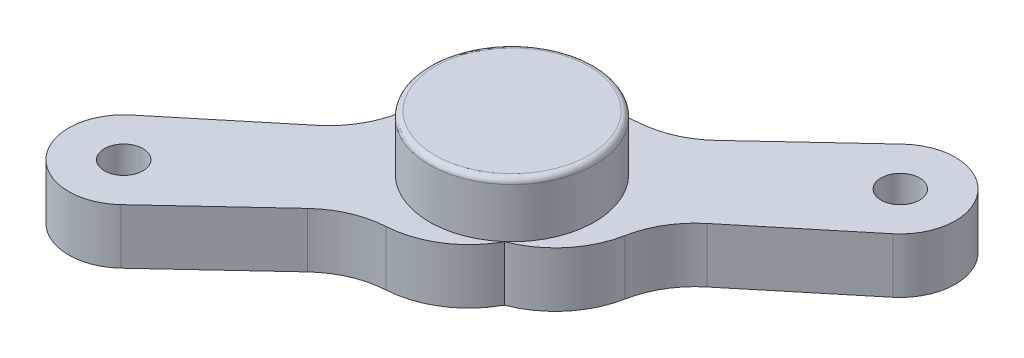
ISO-10303-21;
HEADER;
FILE_DESCRIPTION(('STEP AP214'),'2;1');
FILE_NAME('part.step','',(''),(''),'','','');
FILE_SCHEMA(('AUTOMOTIVE_DESIGN { 1 0 10303 214 1 1 1 1 }'));
ENDSEC;
DATA;
#1=APPLICATION_CONTEXT('core data for automotive mechanical design processes');
#2=APPLICATION_PROTOCOL_DEFINITION('international standard','automotive_design',2000,#1);
#3=PRODUCT_CONTEXT('',#1,'mechanical');
#4=PRODUCT('Part','Part','',(#3));
#5=PRODUCT_RELATED_PRODUCT_CATEGORY('part','',(#4));
#6=PRODUCT_DEFINITION_FORMATION('','',#4);
#7=PRODUCT_DEFINITION_CONTEXT('part definition',#1,'design');
#8=PRODUCT_DEFINITION('design','',#6,#7);
#9=PRODUCT_DEFINITION_SHAPE('','',#8);
#10=(LENGTH_UNIT() NAMED_UNIT(*) SI_UNIT(.MILLI.,.METRE.));
#11=(NAMED_UNIT(*) PLANE_ANGLE_UNIT() SI_UNIT($,.RADIAN.));
#12=(NAMED_UNIT(*) SI_UNIT($,.STERADIAN.) SOLID_ANGLE_UNIT());
#13=UNCERTAINTY_MEASURE_WITH_UNIT(LENGTH_MEASURE(1.E-05),#10,'distance_accuracy_value','');
#14=(GEOMETRIC_REPRESENTATION_CONTEXT(3) GLOBAL_UNCERTAINTY_ASSIGNED_CONTEXT((#13)) GLOBAL_UNIT_ASSIGNED_CONTEXT((#10,
#11,#12)) REPRESENTATION_CONTEXT('',''));
#15=CARTESIAN_POINT('',(0.,0.,0.));
#16=DIRECTION('',(0.,0.,1.));
#17=DIRECTION('',(1.,0.,0.));
#18=AXIS2_PLACEMENT_3D('',#15,#16,#17);
#19=CARTESIAN_POINT('',(0.,5.,0.));
#20=DIRECTION('',(0.,-1.,0.));
#21=DIRECTION('',(0.,0.,-1.));
#22=AXIS2_PLACEMENT_3D('',#19,#20,#21);
#23=CYLINDRICAL_SURFACE('',#22,7.5);
#24=CARTESIAN_POINT('',(0.,4.5,0.));
#25=DIRECTION('',(0.,1.,0.));
#26=DIRECTION('',(0.,0.,1.));
#27=AXIS2_PLACEMENT_3D('',#24,#25,#26);
#28=CIRCLE('',#27,7.5);
#29=CARTESIAN_POINT('',(0.,4.5,7.5));
#30=VERTEX_POINT('',#29);
#31=EDGE_CURVE('E11',#30,#30,#28,.F.);
#32=ORIENTED_EDGE('',*,*,#31,.T.);
#33=EDGE_LOOP('',(#32));
#34=FACE_BOUND('',#33,.T.);
#35=CARTESIAN_POINT('',(0.,0.,0.));
#36=DIRECTION('',(0.,1.,0.));
#37=DIRECTION('',(0.,0.,1.));
#38=AXIS2_PLACEMENT_3D('',#35,#36,#37);
#39=CIRCLE('',#38,7.5);
#40=CARTESIAN_POINT('',(4.94627298267681,0.,5.63776405863543));
#41=VERTEX_POINT('',#40);
#42=CARTESIAN_POINT('',(-4.94627298267681,0.,-5.63776405863543));
#43=VERTEX_POINT('',#42);
#44=EDGE_CURVE('E174',#41,#43,#39,.T.);
#45=ORIENTED_EDGE('',*,*,#44,.T.);
#46=EDGE_CURVE('E164',#43,#41,#39,.T.);
#47=ORIENTED_EDGE('',*,*,#46,.T.);
#48=EDGE_LOOP('',(#45,#47));
#49=FACE_BOUND('',#48,.T.);
#50=ADVANCED_FACE('F39',(#34,#49),#23,.T.);
#51=CARTESIAN_POINT('',(0.,5.,0.));
#52=DIRECTION('',(0.,1.,0.));
#53=DIRECTION('',(0.,0.,1.));
#54=AXIS2_PLACEMENT_3D('',#51,#52,#53);
#55=PLANE('',#54);
#56=CARTESIAN_POINT('',(0.,5.,0.));
#57=DIRECTION('',(0.,1.,0.));
#58=DIRECTION('',(0.,0.,1.));
#59=AXIS2_PLACEMENT_3D('',#56,#57,#58);
#60=CIRCLE('',#59,7.);
#61=CARTESIAN_POINT('',(0.,5.,7.));
#62=VERTEX_POINT('',#61);
#63=EDGE_CURVE('E47',#62,#62,#60,.T.);
#64=ORIENTED_EDGE('',*,*,#63,.T.);
#65=EDGE_LOOP('',(#64));
#66=FACE_BOUND('',#65,.T.);
#67=ADVANCED_FACE('F179',(#66),#55,.T.);
#68=CARTESIAN_POINT('',(2.09264945411429,-5.,-1.8359788294518));
#69=DIRECTION('',(0.,1.,0.));
#70=DIRECTION('',(0.,0.,1.));
#71=AXIS2_PLACEMENT_3D('',#68,#69,#70);
#72=CYLINDRICAL_SURFACE('',#71,8.);
#73=CARTESIAN_POINT('',(2.09264945411429,0.,-1.8359788294518));
#74=DIRECTION('',(0.,1.,0.));
#75=DIRECTION('',(0.,0.,1.));
#76=AXIS2_PLACEMENT_3D('',#73,#74,#75);
#77=CIRCLE('',#76,8.);
#78=CARTESIAN_POINT('',(1.62137411316843,0.,-9.82208548745583));
#79=VERTEX_POINT('',#78);
#80=EDGE_CURVE('E160',#79,#43,#77,.T.);
#81=ORIENTED_EDGE('',*,*,#80,.F.);
#82=DIRECTION('',(0.,1.,0.));
#83=VECTOR('',#82,1.);
#84=CARTESIAN_POINT('',(1.62137411316843,-5.,-9.82208548745583));
#85=LINE('',#84,#83);
#86=CARTESIAN_POINT('',(1.62137411316843,-5.,-9.82208548745583));
#87=VERTEX_POINT('',#86);
#88=EDGE_CURVE('E124',#87,#79,#85,.T.);
#89=ORIENTED_EDGE('',*,*,#88,.F.);
#90=CARTESIAN_POINT('',(2.09264945411429,-5.,-1.8359788294518));
#91=DIRECTION('',(0.,1.,0.));
#92=DIRECTION('',(0.,0.,1.));
#93=AXIS2_PLACEMENT_3D('',#90,#91,#92);
#94=CIRCLE('',#93,8.);
#95=CARTESIAN_POINT('',(-4.94627298267681,-5.,-5.63776405863543));
#96=VERTEX_POINT('',#95);
#97=EDGE_CURVE('E63',#87,#96,#94,.T.);
#98=ORIENTED_EDGE('',*,*,#97,.T.);
#99=DIRECTION('',(0.,1.,0.));
#100=VECTOR('',#99,1.);
#101=CARTESIAN_POINT('',(-4.94627298267681,-5.,-5.63776405863543));
#102=LINE('',#101,#100);
#103=EDGE_CURVE('E89',#96,#43,#102,.T.);
#104=ORIENTED_EDGE('',*,*,#103,.T.);
#105=EDGE_LOOP('',(#81,#89,#98,#104));
#106=FACE_BOUND('',#105,.T.);
#107=ADVANCED_FACE('F196',(#106),#72,.T.);
#108=CARTESIAN_POINT('',(1.15009877222259,-5.,-17.8081921454599));
#109=DIRECTION('',(0.,1.,0.));
#110=DIRECTION('',(0.,0.,1.));
#111=AXIS2_PLACEMENT_3D('',#108,#109,#110);
#112=CYLINDRICAL_SURFACE('',#111,8.00000000000002);
#113=CARTESIAN_POINT('',(1.15009877222259,0.,-17.8081921454599));
#114=DIRECTION('',(0.,-1.,0.));
#115=DIRECTION('',(0.,0.,1.));
#116=AXIS2_PLACEMENT_3D('',#113,#114,#115);
#117=CIRCLE('',#116,8.00000000000002);
#118=CARTESIAN_POINT('',(6.60708123178031,0.,-11.9582910833837));
#119=VERTEX_POINT('',#118);
#120=EDGE_CURVE('E119',#119,#79,#117,.T.);
#121=ORIENTED_EDGE('',*,*,#120,.F.);
#122=DIRECTION('',(0.,1.,0.));
#123=VECTOR('',#122,1.);
#124=CARTESIAN_POINT('',(6.60708123178031,-5.,-11.9582910833837));
#125=LINE('',#124,#123);
#126=CARTESIAN_POINT('',(6.60708123178031,-5.,-11.9582910833837));
#127=VERTEX_POINT('',#126);
#128=EDGE_CURVE('E114',#127,#119,#125,.T.);
#129=ORIENTED_EDGE('',*,*,#128,.F.);
#130=CARTESIAN_POINT('',(1.15009877222259,-5.,-17.8081921454599));
#131=DIRECTION('',(0.,-1.,0.));
#132=DIRECTION('',(0.,0.,1.));
#133=AXIS2_PLACEMENT_3D('',#130,#131,#132);
#134=CIRCLE('',#133,8.00000000000002);
#135=EDGE_CURVE('E117',#127,#87,#134,.T.);
#136=ORIENTED_EDGE('',*,*,#135,.T.);
#137=ORIENTED_EDGE('',*,*,#88,.T.);
#138=EDGE_LOOP('',(#121,#129,#136,#137));
#139=FACE_BOUND('',#138,.T.);
#140=ADVANCED_FACE('F116',(#139),#112,.F.);
#141=CARTESIAN_POINT('',(6.60708123178031,-5.,-11.9582910833837));
#142=DIRECTION('',(-0.682122807444714,0.,-0.731237632759517));
#143=DIRECTION('',(-0.731237632759517,0.,0.682122807444714));
#144=AXIS2_PLACEMENT_3D('',#141,#142,#143);
#145=PLANE('',#144);
#146=DIRECTION('',(-0.731237632759517,0.,0.682122807444714));
#147=VECTOR('',#146,1.);
#148=CARTESIAN_POINT('',(6.60708123178031,0.,-11.9582910833837));
#149=LINE('',#148,#147);
#150=CARTESIAN_POINT('',(15.3819328248945,0.,-20.1437647727203));
#151=VERTEX_POINT('',#150);
#152=EDGE_CURVE('E157',#151,#119,#149,.T.);
#153=ORIENTED_EDGE('',*,*,#152,.F.);
#154=DIRECTION('',(0.,1.,0.));
#155=VECTOR('',#154,1.);
#156=CARTESIAN_POINT('',(15.3819328248945,-5.,-20.1437647727203));
#157=LINE('',#156,#155);
#158=CARTESIAN_POINT('',(15.3819328248945,-5.,-20.1437647727203));
#159=VERTEX_POINT('',#158);
#160=EDGE_CURVE('E125',#159,#151,#157,.T.);
#161=ORIENTED_EDGE('',*,*,#160,.F.);
#162=DIRECTION('',(-0.731237632759517,0.,0.682122807444714));
#163=VECTOR('',#162,1.);
#164=CARTESIAN_POINT('',(6.60708123178031,-5.,-11.9582910833837));
#165=LINE('',#164,#163);
#166=EDGE_CURVE('E133',#159,#127,#165,.T.);
#167=ORIENTED_EDGE('',*,*,#166,.T.);
#168=ORIENTED_EDGE('',*,*,#128,.T.);
#169=EDGE_LOOP('',(#153,#161,#167,#168));
#170=FACE_BOUND('',#169,.T.);
#171=ADVANCED_FACE('F137',(#170),#145,.T.);
#172=CARTESIAN_POINT('',(18.7925468621181,-5.,-16.4875766089227));
#173=DIRECTION('',(0.,1.,0.));
#174=DIRECTION('',(0.,0.,1.));
#175=AXIS2_PLACEMENT_3D('',#172,#173,#174);
#176=CYLINDRICAL_SURFACE('',#175,5.);
#177=CARTESIAN_POINT('',(18.7925468621181,0.,-16.4875766089227));
#178=DIRECTION('',(0.,1.,0.));
#179=DIRECTION('',(0.,0.,-1.));
#180=AXIS2_PLACEMENT_3D('',#177,#178,#179);
#181=CIRCLE('',#180,5.);
#182=CARTESIAN_POINT('',(21.9738953350123,0.,-12.6302430876915));
#183=VERTEX_POINT('',#182);
#184=EDGE_CURVE('E154',#183,#151,#181,.T.);
#185=ORIENTED_EDGE('',*,*,#184,.F.);
#186=DIRECTION('',(0.,1.,0.));
#187=VECTOR('',#186,1.);
#188=CARTESIAN_POINT('',(21.9738953350123,-5.,-12.6302430876915));
#189=LINE('',#188,#187);
#190=CARTESIAN_POINT('',(21.9738953350123,-5.,-12.6302430876915));
#191=VERTEX_POINT('',#190);
#192=EDGE_CURVE('E167',#191,#183,#189,.T.);
#193=ORIENTED_EDGE('',*,*,#192,.F.);
#194=CARTESIAN_POINT('',(18.7925468621181,-5.,-16.4875766089227));
#195=DIRECTION('',(0.,1.,0.));
#196=DIRECTION('',(0.,0.,-1.));
#197=AXIS2_PLACEMENT_3D('',#194,#195,#196);
#198=CIRCLE('',#197,5.);
#199=EDGE_CURVE('E138',#191,#159,#198,.T.);
#200=ORIENTED_EDGE('',*,*,#199,.T.);
#201=ORIENTED_EDGE('',*,*,#160,.T.);
#202=EDGE_LOOP('',(#185,#193,#200,#201));
#203=FACE_BOUND('',#202,.T.);
#204=ADVANCED_FACE('F209',(#203),#176,.T.);
#205=CARTESIAN_POINT('',(12.7162948840575,-5.,-4.99500675274544));
#206=DIRECTION('',(0.636269694578841,0.,0.771466704246236));
#207=DIRECTION('',(0.771466704246236,0.,-0.636269694578841));
#208=AXIS2_PLACEMENT_3D('',#205,#206,#207);
#209=PLANE('',#208);
#210=DIRECTION('',(0.771466704246236,0.,-0.636269694578841));
#211=VECTOR('',#210,1.);
#212=CARTESIAN_POINT('',(12.7162948840575,0.,-4.99500675274544));
#213=LINE('',#212,#211);
#214=CARTESIAN_POINT('',(12.7162948840575,0.,-4.99500675274544));
#215=VERTEX_POINT('',#214);
#216=EDGE_CURVE('E151',#215,#183,#213,.T.);
#217=ORIENTED_EDGE('',*,*,#216,.F.);
#218=DIRECTION('',(0.,1.,0.));
#219=VECTOR('',#218,1.);
#220=CARTESIAN_POINT('',(12.7162948840575,-5.,-4.99500675274544));
#221=LINE('',#220,#219);
#222=CARTESIAN_POINT('',(12.7162948840575,-5.,-4.99500675274544));
#223=VERTEX_POINT('',#222);
#224=EDGE_CURVE('E169',#223,#215,#221,.T.);
#225=ORIENTED_EDGE('',*,*,#224,.F.);
#226=DIRECTION('',(0.771466704246236,0.,-0.636269694578841));
#227=VECTOR('',#226,1.);
#228=CARTESIAN_POINT('',(12.7162948840575,-5.,-4.99500675274544));
#229=LINE('',#228,#227);
#230=EDGE_CURVE('E140',#223,#191,#229,.T.);
#231=ORIENTED_EDGE('',*,*,#230,.T.);
#232=ORIENTED_EDGE('',*,*,#192,.T.);
#233=EDGE_LOOP('',(#217,#225,#231,#232));
#234=FACE_BOUND('',#233,.T.);
#235=ADVANCED_FACE('F206',(#234),#209,.T.);
#236=CARTESIAN_POINT('',(17.8064524406882,-5.,1.17672688122446));
#237=DIRECTION('',(0.,1.,0.));
#238=DIRECTION('',(0.,0.,1.));
#239=AXIS2_PLACEMENT_3D('',#236,#237,#238);
#240=CYLINDRICAL_SURFACE('',#239,8.00000000000003);
#241=CARTESIAN_POINT('',(17.8064524406882,0.,1.17672688122446));
#242=DIRECTION('',(0.,-1.,0.));
#243=DIRECTION('',(0.,0.,-1.));
#244=AXIS2_PLACEMENT_3D('',#241,#242,#243);
#245=CIRCLE('',#244,8.00000000000003);
#246=CARTESIAN_POINT('',(9.94955094740123,0.,-0.329625974113668));
#247=VERTEX_POINT('',#246);
#248=EDGE_CURVE('E147',#247,#215,#245,.T.);
#249=ORIENTED_EDGE('',*,*,#248,.F.);
#250=DIRECTION('',(0.,1.,0.));
#251=VECTOR('',#250,1.);
#252=CARTESIAN_POINT('',(9.94955094740123,-5.,-0.329625974113668));
#253=LINE('',#252,#251);
#254=CARTESIAN_POINT('',(9.94955094740123,-5.,-0.329625974113668));
#255=VERTEX_POINT('',#254);
#256=EDGE_CURVE('E97',#255,#247,#253,.T.);
#257=ORIENTED_EDGE('',*,*,#256,.F.);
#258=CARTESIAN_POINT('',(17.8064524406882,-5.,1.17672688122446));
#259=DIRECTION('',(0.,-1.,0.));
#260=DIRECTION('',(0.,0.,-1.));
#261=AXIS2_PLACEMENT_3D('',#258,#259,#260);
#262=CIRCLE('',#261,8.00000000000003);
#263=EDGE_CURVE('E329',#255,#223,#262,.T.);
#264=ORIENTED_EDGE('',*,*,#263,.T.);
#265=ORIENTED_EDGE('',*,*,#224,.T.);
#266=EDGE_LOOP('',(#249,#257,#264,#265));
#267=FACE_BOUND('',#266,.T.);
#268=ADVANCED_FACE('F203',(#267),#240,.F.);
#269=CARTESIAN_POINT('',(2.09264945411429,-5.,-1.8359788294518));
#270=DIRECTION('',(0.,1.,0.));
#271=DIRECTION('',(0.,0.,1.));
#272=AXIS2_PLACEMENT_3D('',#269,#270,#271);
#273=CYLINDRICAL_SURFACE('',#272,8.);
#274=CARTESIAN_POINT('',(2.09264945411429,0.,-1.8359788294518));
#275=DIRECTION('',(0.,1.,0.));
#276=DIRECTION('',(0.,0.,-1.));
#277=AXIS2_PLACEMENT_3D('',#274,#275,#276);
#278=CIRCLE('',#277,8.);
#279=EDGE_CURVE('E54',#41,#247,#278,.T.);
#280=ORIENTED_EDGE('',*,*,#279,.F.);
#281=DIRECTION('',(0.,1.,0.));
#282=VECTOR('',#281,1.);
#283=CARTESIAN_POINT('',(4.94627298267682,-5.,5.63776405863543));
#284=LINE('',#283,#282);
#285=CARTESIAN_POINT('',(4.94627298267681,-5.,5.63776405863543));
#286=VERTEX_POINT('',#285);
#287=EDGE_CURVE('E145',#286,#41,#284,.T.);
#288=ORIENTED_EDGE('',*,*,#287,.F.);
#289=CARTESIAN_POINT('',(2.09264945411429,-5.,-1.8359788294518));
#290=DIRECTION('',(0.,1.,0.));
#291=DIRECTION('',(0.,0.,-1.));
#292=AXIS2_PLACEMENT_3D('',#289,#290,#291);
#293=CIRCLE('',#292,8.);
#294=EDGE_CURVE('E162',#286,#255,#293,.T.);
#295=ORIENTED_EDGE('',*,*,#294,.T.);
#296=ORIENTED_EDGE('',*,*,#256,.T.);
#297=EDGE_LOOP('',(#280,#288,#295,#296));
#298=FACE_BOUND('',#297,.T.);
#299=ADVANCED_FACE('F200',(#298),#273,.T.);
#300=CARTESIAN_POINT('',(2.09264945411429,-5.,-1.8359788294518));
#301=DIRECTION('',(0.,1.,0.));
#302=DIRECTION('',(0.,0.,1.));
#303=AXIS2_PLACEMENT_3D('',#300,#301,#302);
#304=PLANE('',#303);
#305=CARTESIAN_POINT('',(18.7925468621181,-5.,-16.4875766089227));
#306=DIRECTION('',(0.,1.,0.));
#307=DIRECTION('',(0.,0.,1.));
#308=AXIS2_PLACEMENT_3D('',#305,#306,#307);
#309=CIRCLE('',#308,1.75000000000005);
#310=CARTESIAN_POINT('',(18.7925468621181,-5.,-14.7375766089227));
#311=VERTEX_POINT('',#310);
#312=EDGE_CURVE('E148',#311,#311,#309,.T.);
#313=ORIENTED_EDGE('',*,*,#312,.T.);
#314=EDGE_LOOP('',(#313));
#315=FACE_BOUND('',#314,.T.);
#316=ORIENTED_EDGE('',*,*,#294,.F.);
#317=CARTESIAN_POINT('',(-2.09264945411429,-5.,1.8359788294518));
#318=DIRECTION('',(0.,1.,0.));
#319=DIRECTION('',(0.,0.,-1.));
#320=AXIS2_PLACEMENT_3D('',#317,#318,#319);
#321=CIRCLE('',#320,8.);
#322=CARTESIAN_POINT('',(-1.62137411316843,-5.,9.82208548745583));
#323=VERTEX_POINT('',#322);
#324=EDGE_CURVE('E291',#323,#286,#321,.T.);
#325=ORIENTED_EDGE('',*,*,#324,.F.);
#326=CARTESIAN_POINT('',(-1.15009877222259,-5.,17.8081921454599));
#327=DIRECTION('',(0.,-1.,0.));
#328=DIRECTION('',(0.,0.,-1.));
#329=AXIS2_PLACEMENT_3D('',#326,#327,#328);
#330=CIRCLE('',#329,8.00000000000002);
#331=CARTESIAN_POINT('',(-6.60708123178031,-5.,11.9582910833837));
#332=VERTEX_POINT('',#331);
#333=EDGE_CURVE('E344',#332,#323,#330,.T.);
#334=ORIENTED_EDGE('',*,*,#333,.F.);
#335=DIRECTION('',(0.731237632759517,0.,-0.682122807444714));
#336=VECTOR('',#335,1.);
#337=CARTESIAN_POINT('',(-6.60708123178031,-5.,11.9582910833837));
#338=LINE('',#337,#336);
#339=CARTESIAN_POINT('',(-15.3819328248945,-5.,20.1437647727203));
#340=VERTEX_POINT('',#339);
#341=EDGE_CURVE('E345',#340,#332,#338,.T.);
#342=ORIENTED_EDGE('',*,*,#341,.F.);
#343=CARTESIAN_POINT('',(-18.7925468621181,-5.,16.4875766089227));
#344=DIRECTION('',(0.,1.,0.));
#345=DIRECTION('',(0.,0.,1.));
#346=AXIS2_PLACEMENT_3D('',#343,#344,#345);
#347=CIRCLE('',#346,5.);
#348=CARTESIAN_POINT('',(-21.9738953350123,-5.,12.6302430876915));
#349=VERTEX_POINT('',#348);
#350=EDGE_CURVE('E348',#349,#340,#347,.T.);
#351=ORIENTED_EDGE('',*,*,#350,.F.);
#352=DIRECTION('',(-0.771466704246236,0.,0.636269694578841));
#353=VECTOR('',#352,1.);
#354=CARTESIAN_POINT('',(-12.7162948840575,-5.,4.99500675274544));
#355=LINE('',#354,#353);
#356=CARTESIAN_POINT('',(-12.7162948840575,-5.,4.99500675274544));
#357=VERTEX_POINT('',#356);
#358=EDGE_CURVE('E353',#357,#349,#355,.T.);
#359=ORIENTED_EDGE('',*,*,#358,.F.);
#360=CARTESIAN_POINT('',(-17.8064524406882,-5.,-1.17672688122446));
#361=DIRECTION('',(0.,-1.,0.));
#362=DIRECTION('',(0.,0.,1.));
#363=AXIS2_PLACEMENT_3D('',#360,#361,#362);
#364=CIRCLE('',#363,8.00000000000003);
#365=CARTESIAN_POINT('',(-9.94955094740123,-5.,0.329625974113668));
#366=VERTEX_POINT('',#365);
#367=EDGE_CURVE('E356',#366,#357,#364,.T.);
#368=ORIENTED_EDGE('',*,*,#367,.F.);
#369=CARTESIAN_POINT('',(-2.09264945411429,-5.,1.8359788294518));
#370=DIRECTION('',(0.,1.,0.));
#371=DIRECTION('',(0.,0.,1.));
#372=AXIS2_PLACEMENT_3D('',#369,#370,#371);
#373=CIRCLE('',#372,8.);
#374=EDGE_CURVE('E305',#96,#366,#373,.T.);
#375=ORIENTED_EDGE('',*,*,#374,.F.);
#376=ORIENTED_EDGE('',*,*,#97,.F.);
#377=ORIENTED_EDGE('',*,*,#135,.F.);
#378=ORIENTED_EDGE('',*,*,#166,.F.);
#379=ORIENTED_EDGE('',*,*,#199,.F.);
#380=ORIENTED_EDGE('',*,*,#230,.F.);
#381=ORIENTED_EDGE('',*,*,#263,.F.);
#382=EDGE_LOOP('',(#316,#325,#334,#342,#351,#359,#368,#375,#376,#377,#378,#379,#380,#381));
#383=FACE_BOUND('',#382,.T.);
#384=CARTESIAN_POINT('',(-18.7925468621181,-5.,16.4875766089227));
#385=DIRECTION('',(0.,1.,0.));
#386=DIRECTION('',(0.,0.,-1.));
#387=AXIS2_PLACEMENT_3D('',#384,#385,#386);
#388=CIRCLE('',#387,1.75000000000005);
#389=CARTESIAN_POINT('',(-18.7925468621181,-5.,14.7375766089227));
#390=VERTEX_POINT('',#389);
#391=EDGE_CURVE('E284',#390,#390,#388,.T.);
#392=ORIENTED_EDGE('',*,*,#391,.T.);
#393=EDGE_LOOP('',(#392));
#394=FACE_BOUND('',#393,.T.);
#395=ADVANCED_FACE('F130',(#315,#383,#394),#304,.F.);
#396=CARTESIAN_POINT('',(2.09264945411429,0.,-1.8359788294518));
#397=DIRECTION('',(0.,1.,0.));
#398=DIRECTION('',(0.,0.,1.));
#399=AXIS2_PLACEMENT_3D('',#396,#397,#398);
#400=PLANE('',#399);
#401=ORIENTED_EDGE('',*,*,#44,.F.);
#402=ORIENTED_EDGE('',*,*,#279,.T.);
#403=ORIENTED_EDGE('',*,*,#248,.T.);
#404=ORIENTED_EDGE('',*,*,#216,.T.);
#405=ORIENTED_EDGE('',*,*,#184,.T.);
#406=ORIENTED_EDGE('',*,*,#152,.T.);
#407=ORIENTED_EDGE('',*,*,#120,.T.);
#408=ORIENTED_EDGE('',*,*,#80,.T.);
#409=EDGE_LOOP('',(#401,#402,#403,#404,#405,#406,#407,#408));
#410=FACE_BOUND('',#409,.T.);
#411=CARTESIAN_POINT('',(18.7925468621181,0.,-16.4875766089227));
#412=DIRECTION('',(0.,1.,0.));
#413=DIRECTION('',(0.,0.,1.));
#414=AXIS2_PLACEMENT_3D('',#411,#412,#413);
#415=CIRCLE('',#414,1.75000000000005);
#416=CARTESIAN_POINT('',(18.7925468621181,0.,-14.7375766089227));
#417=VERTEX_POINT('',#416);
#418=EDGE_CURVE('E309',#417,#417,#415,.T.);
#419=ORIENTED_EDGE('',*,*,#418,.F.);
#420=EDGE_LOOP('',(#419));
#421=FACE_BOUND('',#420,.T.);
#422=ADVANCED_FACE('F220',(#410,#421),#400,.T.);
#423=CARTESIAN_POINT('',(18.7925468621181,-5.,-16.4875766089227));
#424=DIRECTION('',(0.,1.,0.));
#425=DIRECTION('',(0.,0.,1.));
#426=AXIS2_PLACEMENT_3D('',#423,#424,#425);
#427=CYLINDRICAL_SURFACE('',#426,1.75000000000005);
#428=ORIENTED_EDGE('',*,*,#312,.F.);
#429=EDGE_LOOP('',(#428));
#430=FACE_BOUND('',#429,.T.);
#431=ORIENTED_EDGE('',*,*,#418,.T.);
#432=EDGE_LOOP('',(#431));
#433=FACE_BOUND('',#432,.T.);
#434=ADVANCED_FACE('F223',(#430,#433),#427,.F.);
#435=CARTESIAN_POINT('',(-2.09264945411429,0.,1.8359788294518));
#436=DIRECTION('',(0.,1.,0.));
#437=DIRECTION('',(0.,0.,-1.));
#438=AXIS2_PLACEMENT_3D('',#435,#436,#437);
#439=PLANE('',#438);
#440=CARTESIAN_POINT('',(-18.7925468621181,0.,16.4875766089227));
#441=DIRECTION('',(0.,1.,0.));
#442=DIRECTION('',(0.,0.,-1.));
#443=AXIS2_PLACEMENT_3D('',#440,#441,#442);
#444=CIRCLE('',#443,1.75000000000005);
#445=CARTESIAN_POINT('',(-18.7925468621181,0.,14.7375766089227));
#446=VERTEX_POINT('',#445);
#447=EDGE_CURVE('E266',#446,#446,#444,.T.);
#448=ORIENTED_EDGE('',*,*,#447,.F.);
#449=EDGE_LOOP('',(#448));
#450=FACE_BOUND('',#449,.T.);
#451=ORIENTED_EDGE('',*,*,#46,.F.);
#452=CARTESIAN_POINT('',(-2.09264945411429,0.,1.8359788294518));
#453=DIRECTION('',(0.,1.,0.));
#454=DIRECTION('',(0.,0.,1.));
#455=AXIS2_PLACEMENT_3D('',#452,#453,#454);
#456=CIRCLE('',#455,8.);
#457=CARTESIAN_POINT('',(-9.94955094740123,0.,0.329625974113668));
#458=VERTEX_POINT('',#457);
#459=EDGE_CURVE('E274',#43,#458,#456,.T.);
#460=ORIENTED_EDGE('',*,*,#459,.T.);
#461=CARTESIAN_POINT('',(-17.8064524406882,0.,-1.17672688122446));
#462=DIRECTION('',(0.,-1.,0.));
#463=DIRECTION('',(0.,0.,1.));
#464=AXIS2_PLACEMENT_3D('',#461,#462,#463);
#465=CIRCLE('',#464,8.00000000000003);
#466=CARTESIAN_POINT('',(-12.7162948840575,0.,4.99500675274544));
#467=VERTEX_POINT('',#466);
#468=EDGE_CURVE('E283',#458,#467,#465,.T.);
#469=ORIENTED_EDGE('',*,*,#468,.T.);
#470=DIRECTION('',(-0.771466704246236,0.,0.636269694578841));
#471=VECTOR('',#470,1.);
#472=CARTESIAN_POINT('',(-12.7162948840575,0.,4.99500675274544));
#473=LINE('',#472,#471);
#474=CARTESIAN_POINT('',(-21.9738953350123,0.,12.6302430876915));
#475=VERTEX_POINT('',#474);
#476=EDGE_CURVE('E286',#467,#475,#473,.T.);
#477=ORIENTED_EDGE('',*,*,#476,.T.);
#478=CARTESIAN_POINT('',(-18.7925468621181,0.,16.4875766089227));
#479=DIRECTION('',(0.,1.,0.));
#480=DIRECTION('',(0.,0.,1.));
#481=AXIS2_PLACEMENT_3D('',#478,#479,#480);
#482=CIRCLE('',#481,5.);
#483=CARTESIAN_POINT('',(-15.3819328248945,0.,20.1437647727203));
#484=VERTEX_POINT('',#483);
#485=EDGE_CURVE('E296',#475,#484,#482,.T.);
#486=ORIENTED_EDGE('',*,*,#485,.T.);
#487=DIRECTION('',(0.731237632759517,0.,-0.682122807444714));
#488=VECTOR('',#487,1.);
#489=CARTESIAN_POINT('',(-6.60708123178031,0.,11.9582910833837));
#490=LINE('',#489,#488);
#491=CARTESIAN_POINT('',(-6.60708123178031,0.,11.9582910833837));
#492=VERTEX_POINT('',#491);
#493=EDGE_CURVE('E299',#484,#492,#490,.T.);
#494=ORIENTED_EDGE('',*,*,#493,.T.);
#495=CARTESIAN_POINT('',(-1.15009877222259,0.,17.8081921454599));
#496=DIRECTION('',(0.,-1.,0.));
#497=DIRECTION('',(0.,0.,-1.));
#498=AXIS2_PLACEMENT_3D('',#495,#496,#497);
#499=CIRCLE('',#498,8.00000000000002);
#500=CARTESIAN_POINT('',(-1.62137411316843,0.,9.82208548745583));
#501=VERTEX_POINT('',#500);
#502=EDGE_CURVE('E302',#492,#501,#499,.T.);
#503=ORIENTED_EDGE('',*,*,#502,.T.);
#504=CARTESIAN_POINT('',(-2.09264945411429,0.,1.8359788294518));
#505=DIRECTION('',(0.,1.,0.));
#506=DIRECTION('',(0.,0.,-1.));
#507=AXIS2_PLACEMENT_3D('',#504,#505,#506);
#508=CIRCLE('',#507,8.);
#509=EDGE_CURVE('E277',#501,#41,#508,.T.);
#510=ORIENTED_EDGE('',*,*,#509,.T.);
#511=EDGE_LOOP('',(#451,#460,#469,#477,#486,#494,#503,#510));
#512=FACE_BOUND('',#511,.T.);
#513=ADVANCED_FACE('F230',(#450,#512),#439,.T.);
#514=CARTESIAN_POINT('',(-2.09264945411429,-5.,1.8359788294518));
#515=DIRECTION('',(0.,1.,0.));
#516=DIRECTION('',(0.,0.,1.));
#517=AXIS2_PLACEMENT_3D('',#514,#515,#516);
#518=CYLINDRICAL_SURFACE('',#517,8.);
#519=ORIENTED_EDGE('',*,*,#509,.F.);
#520=DIRECTION('',(0.,1.,0.));
#521=VECTOR('',#520,1.);
#522=CARTESIAN_POINT('',(-1.62137411316843,-5.,9.82208548745583));
#523=LINE('',#522,#521);
#524=EDGE_CURVE('E306',#323,#501,#523,.T.);
#525=ORIENTED_EDGE('',*,*,#524,.F.);
#526=ORIENTED_EDGE('',*,*,#324,.T.);
#527=ORIENTED_EDGE('',*,*,#287,.T.);
#528=EDGE_LOOP('',(#519,#525,#526,#527));
#529=FACE_BOUND('',#528,.T.);
#530=ADVANCED_FACE('F254',(#529),#518,.T.);
#531=CARTESIAN_POINT('',(-1.15009877222259,-5.,17.8081921454599));
#532=DIRECTION('',(0.,1.,0.));
#533=DIRECTION('',(0.,0.,1.));
#534=AXIS2_PLACEMENT_3D('',#531,#532,#533);
#535=CYLINDRICAL_SURFACE('',#534,8.00000000000002);
#536=ORIENTED_EDGE('',*,*,#502,.F.);
#537=DIRECTION('',(0.,1.,0.));
#538=VECTOR('',#537,1.);
#539=CARTESIAN_POINT('',(-6.60708123178031,-5.,11.9582910833837));
#540=LINE('',#539,#538);
#541=EDGE_CURVE('E310',#332,#492,#540,.T.);
#542=ORIENTED_EDGE('',*,*,#541,.F.);
#543=ORIENTED_EDGE('',*,*,#333,.T.);
#544=ORIENTED_EDGE('',*,*,#524,.T.);
#545=EDGE_LOOP('',(#536,#542,#543,#544));
#546=FACE_BOUND('',#545,.T.);
#547=ADVANCED_FACE('F250',(#546),#535,.F.);
#548=CARTESIAN_POINT('',(-6.60708123178031,-5.,11.9582910833837));
#549=DIRECTION('',(0.682122807444714,0.,0.731237632759517));
#550=DIRECTION('',(0.731237632759517,0.,-0.682122807444714));
#551=AXIS2_PLACEMENT_3D('',#548,#549,#550);
#552=PLANE('',#551);
#553=ORIENTED_EDGE('',*,*,#493,.F.);
#554=DIRECTION('',(0.,1.,0.));
#555=VECTOR('',#554,1.);
#556=CARTESIAN_POINT('',(-15.3819328248945,-5.,20.1437647727203));
#557=LINE('',#556,#555);
#558=EDGE_CURVE('E313',#340,#484,#557,.T.);
#559=ORIENTED_EDGE('',*,*,#558,.F.);
#560=ORIENTED_EDGE('',*,*,#341,.T.);
#561=ORIENTED_EDGE('',*,*,#541,.T.);
#562=EDGE_LOOP('',(#553,#559,#560,#561));
#563=FACE_BOUND('',#562,.T.);
#564=ADVANCED_FACE('F246',(#563),#552,.T.);
#565=CARTESIAN_POINT('',(-18.7925468621181,-5.,16.4875766089227));
#566=DIRECTION('',(0.,1.,0.));
#567=DIRECTION('',(0.,0.,1.));
#568=AXIS2_PLACEMENT_3D('',#565,#566,#567);
#569=CYLINDRICAL_SURFACE('',#568,5.);
#570=ORIENTED_EDGE('',*,*,#485,.F.);
#571=DIRECTION('',(0.,1.,0.));
#572=VECTOR('',#571,1.);
#573=CARTESIAN_POINT('',(-21.9738953350123,-5.,12.6302430876915));
#574=LINE('',#573,#572);
#575=EDGE_CURVE('E316',#349,#475,#574,.T.);
#576=ORIENTED_EDGE('',*,*,#575,.F.);
#577=ORIENTED_EDGE('',*,*,#350,.T.);
#578=ORIENTED_EDGE('',*,*,#558,.T.);
#579=EDGE_LOOP('',(#570,#576,#577,#578));
#580=FACE_BOUND('',#579,.T.);
#581=ADVANCED_FACE('F242',(#580),#569,.T.);
#582=CARTESIAN_POINT('',(-12.7162948840575,-5.,4.99500675274544));
#583=DIRECTION('',(-0.636269694578841,0.,-0.771466704246236));
#584=DIRECTION('',(-0.771466704246236,0.,0.636269694578841));
#585=AXIS2_PLACEMENT_3D('',#582,#583,#584);
#586=PLANE('',#585);
#587=ORIENTED_EDGE('',*,*,#476,.F.);
#588=DIRECTION('',(0.,1.,0.));
#589=VECTOR('',#588,1.);
#590=CARTESIAN_POINT('',(-12.7162948840575,-5.,4.99500675274544));
#591=LINE('',#590,#589);
#592=EDGE_CURVE('E319',#357,#467,#591,.T.);
#593=ORIENTED_EDGE('',*,*,#592,.F.);
#594=ORIENTED_EDGE('',*,*,#358,.T.);
#595=ORIENTED_EDGE('',*,*,#575,.T.);
#596=EDGE_LOOP('',(#587,#593,#594,#595));
#597=FACE_BOUND('',#596,.T.);
#598=ADVANCED_FACE('F238',(#597),#586,.T.);
#599=CARTESIAN_POINT('',(-17.8064524406882,-5.,-1.17672688122446));
#600=DIRECTION('',(0.,1.,0.));
#601=DIRECTION('',(0.,0.,1.));
#602=AXIS2_PLACEMENT_3D('',#599,#600,#601);
#603=CYLINDRICAL_SURFACE('',#602,8.00000000000003);
#604=ORIENTED_EDGE('',*,*,#468,.F.);
#605=DIRECTION('',(0.,1.,0.));
#606=VECTOR('',#605,1.);
#607=CARTESIAN_POINT('',(-9.94955094740123,-5.,0.329625974113668));
#608=LINE('',#607,#606);
#609=EDGE_CURVE('E281',#366,#458,#608,.T.);
#610=ORIENTED_EDGE('',*,*,#609,.F.);
#611=ORIENTED_EDGE('',*,*,#367,.T.);
#612=ORIENTED_EDGE('',*,*,#592,.T.);
#613=EDGE_LOOP('',(#604,#610,#611,#612));
#614=FACE_BOUND('',#613,.T.);
#615=ADVANCED_FACE('F234',(#614),#603,.F.);
#616=CARTESIAN_POINT('',(-2.09264945411429,-5.,1.8359788294518));
#617=DIRECTION('',(0.,1.,0.));
#618=DIRECTION('',(0.,0.,1.));
#619=AXIS2_PLACEMENT_3D('',#616,#617,#618);
#620=CYLINDRICAL_SURFACE('',#619,8.);
#621=ORIENTED_EDGE('',*,*,#459,.F.);
#622=ORIENTED_EDGE('',*,*,#103,.F.);
#623=ORIENTED_EDGE('',*,*,#374,.T.);
#624=ORIENTED_EDGE('',*,*,#609,.T.);
#625=EDGE_LOOP('',(#621,#622,#623,#624));
#626=FACE_BOUND('',#625,.T.);
#627=ADVANCED_FACE('F188',(#626),#620,.T.);
#628=CARTESIAN_POINT('',(-18.7925468621181,-5.,16.4875766089227));
#629=DIRECTION('',(0.,1.,0.));
#630=DIRECTION('',(0.,0.,1.));
#631=AXIS2_PLACEMENT_3D('',#628,#629,#630);
#632=CYLINDRICAL_SURFACE('',#631,1.75000000000005);
#633=ORIENTED_EDGE('',*,*,#391,.F.);
#634=EDGE_LOOP('',(#633));
#635=FACE_BOUND('',#634,.T.);
#636=ORIENTED_EDGE('',*,*,#447,.T.);
#637=EDGE_LOOP('',(#636));
#638=FACE_BOUND('',#637,.T.);
#639=ADVANCED_FACE('F182',(#635,#638),#632,.F.);
#640=CARTESIAN_POINT('',(0.,4.5,0.));
#641=DIRECTION('',(0.,1.,0.));
#642=DIRECTION('',(0.,0.,1.));
#643=AXIS2_PLACEMENT_3D('',#640,#641,#642);
#644=TOROIDAL_SURFACE('',#643,7.,0.5);
#645=ORIENTED_EDGE('',*,*,#31,.F.);
#646=EDGE_LOOP('',(#645));
#647=FACE_BOUND('',#646,.T.);
#648=ORIENTED_EDGE('',*,*,#63,.F.);
#649=EDGE_LOOP('',(#648));
#650=FACE_BOUND('',#649,.T.);
#651=ADVANCED_FACE('F41',(#647,#650),#644,.T.);
#652=CLOSED_SHELL('',(#50,#67,#107,#140,#171,#204,#235,#268,#299,#395,#422,#434,#513,#530,#547,
#564,#581,#598,#615,#627,#639,#651));
#653=MANIFOLD_SOLID_BREP('B2',#652);
#654=ADVANCED_BREP_SHAPE_REPRESENTATION('',(#18,#653),#14);
#655=SHAPE_DEFINITION_REPRESENTATION(#9,#654);
ENDSEC;
END-ISO-10303-21;
